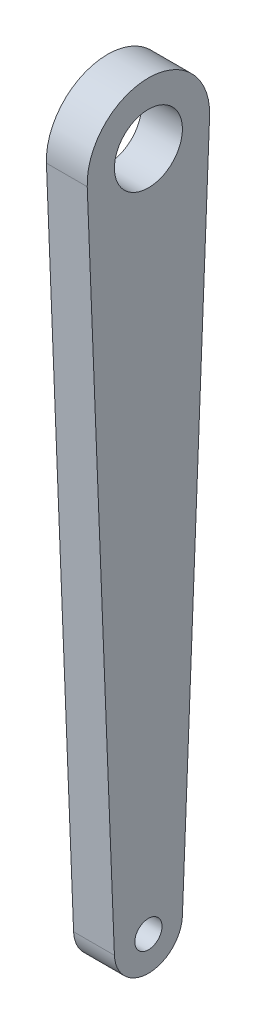
ISO-10303-21;
HEADER;
FILE_DESCRIPTION(('STEP AP214'),'2;1');
FILE_NAME('part.step','',(''),(''),'','','');
FILE_SCHEMA(('AUTOMOTIVE_DESIGN { 1 0 10303 214 1 1 1 1 }'));
ENDSEC;
DATA;
#1=APPLICATION_CONTEXT('core data for automotive mechanical design processes');
#2=APPLICATION_PROTOCOL_DEFINITION('international standard','automotive_design',2000,#1);
#3=PRODUCT_CONTEXT('',#1,'mechanical');
#4=PRODUCT('Part','Part','',(#3));
#5=PRODUCT_RELATED_PRODUCT_CATEGORY('part','',(#4));
#6=PRODUCT_DEFINITION_FORMATION('','',#4);
#7=PRODUCT_DEFINITION_CONTEXT('part definition',#1,'design');
#8=PRODUCT_DEFINITION('design','',#6,#7);
#9=PRODUCT_DEFINITION_SHAPE('','',#8);
#10=(LENGTH_UNIT() NAMED_UNIT(*) SI_UNIT(.MILLI.,.METRE.));
#11=(NAMED_UNIT(*) PLANE_ANGLE_UNIT() SI_UNIT($,.RADIAN.));
#12=(NAMED_UNIT(*) SI_UNIT($,.STERADIAN.) SOLID_ANGLE_UNIT());
#13=UNCERTAINTY_MEASURE_WITH_UNIT(LENGTH_MEASURE(1.E-05),#10,'distance_accuracy_value','');
#14=(GEOMETRIC_REPRESENTATION_CONTEXT(3) GLOBAL_UNCERTAINTY_ASSIGNED_CONTEXT((#13)) GLOBAL_UNIT_ASSIGNED_CONTEXT((#10,
#11,#12)) REPRESENTATION_CONTEXT('',''));
#15=CARTESIAN_POINT('',(0.,0.,0.));
#16=DIRECTION('',(0.,0.,1.));
#17=DIRECTION('',(1.,0.,0.));
#18=AXIS2_PLACEMENT_3D('',#15,#16,#17);
#19=CARTESIAN_POINT('',(3.,0.,0.));
#20=DIRECTION('',(1.,0.,0.));
#21=DIRECTION('',(0.,0.,-1.));
#22=AXIS2_PLACEMENT_3D('',#19,#20,#21);
#23=PLANE('',#22);
#24=CARTESIAN_POINT('',(3.,0.,0.));
#25=DIRECTION('',(1.,0.,0.));
#26=DIRECTION('',(0.,0.,-1.));
#27=AXIS2_PLACEMENT_3D('',#24,#25,#26);
#28=CIRCLE('',#27,2.5);
#29=CARTESIAN_POINT('',(3.,0.,-2.5));
#30=VERTEX_POINT('',#29);
#31=EDGE_CURVE('E112',#30,#30,#28,.T.);
#32=ORIENTED_EDGE('',*,*,#31,.F.);
#33=EDGE_LOOP('',(#32));
#34=FACE_BOUND('',#33,.T.);
#35=CARTESIAN_POINT('',(3.,0.,0.));
#36=DIRECTION('',(1.,0.,0.));
#37=DIRECTION('',(0.,0.,-1.));
#38=AXIS2_PLACEMENT_3D('',#35,#36,#37);
#39=CIRCLE('',#38,4.5);
#40=CARTESIAN_POINT('',(3.,-0.18,-4.49639855884685));
#41=VERTEX_POINT('',#40);
#42=CARTESIAN_POINT('',(3.,-0.18,4.49639855884685));
#43=VERTEX_POINT('',#42);
#44=EDGE_CURVE('E92',#41,#43,#39,.T.);
#45=ORIENTED_EDGE('',*,*,#44,.T.);
#46=DIRECTION('',(0.,-0.999199679743744,-0.0400000000000001));
#47=VECTOR('',#46,1.);
#48=CARTESIAN_POINT('',(3.,-0.18,4.49639855884685));
#49=LINE('',#48,#47);
#50=CARTESIAN_POINT('',(3.,-50.1,2.49799919935935));
#51=VERTEX_POINT('',#50);
#52=EDGE_CURVE('E87',#43,#51,#49,.T.);
#53=ORIENTED_EDGE('',*,*,#52,.T.);
#54=CARTESIAN_POINT('',(3.,-50.,0.));
#55=DIRECTION('',(1.,0.,0.));
#56=DIRECTION('',(0.,0.,-1.));
#57=AXIS2_PLACEMENT_3D('',#54,#55,#56);
#58=CIRCLE('',#57,2.49999999999999);
#59=CARTESIAN_POINT('',(3.,-50.1,-2.49799919935936));
#60=VERTEX_POINT('',#59);
#61=EDGE_CURVE('E90',#51,#60,#58,.T.);
#62=ORIENTED_EDGE('',*,*,#61,.T.);
#63=DIRECTION('',(0.,0.999199679743744,-0.0400000000000001));
#64=VECTOR('',#63,1.);
#65=CARTESIAN_POINT('',(3.,-0.18,-4.49639855884685));
#66=LINE('',#65,#64);
#67=EDGE_CURVE('E57',#60,#41,#66,.T.);
#68=ORIENTED_EDGE('',*,*,#67,.T.);
#69=EDGE_LOOP('',(#45,#53,#62,#68));
#70=FACE_BOUND('',#69,.T.);
#71=CARTESIAN_POINT('',(3.,-50.,0.));
#72=DIRECTION('',(1.,0.,0.));
#73=DIRECTION('',(0.,0.,-1.));
#74=AXIS2_PLACEMENT_3D('',#71,#72,#73);
#75=CIRCLE('',#74,1.);
#76=CARTESIAN_POINT('',(3.,-50.,-1.00000000000001));
#77=VERTEX_POINT('',#76);
#78=EDGE_CURVE('E134',#77,#77,#75,.T.);
#79=ORIENTED_EDGE('',*,*,#78,.F.);
#80=EDGE_LOOP('',(#79));
#81=FACE_BOUND('',#80,.T.);
#82=ADVANCED_FACE('F39',(#34,#70,#81),#23,.T.);
#83=CARTESIAN_POINT('',(0.,0.,0.));
#84=DIRECTION('',(1.,0.,0.));
#85=DIRECTION('',(0.,0.,-1.));
#86=AXIS2_PLACEMENT_3D('',#83,#84,#85);
#87=PLANE('',#86);
#88=CARTESIAN_POINT('',(0.,0.,0.));
#89=DIRECTION('',(1.,0.,0.));
#90=DIRECTION('',(0.,0.,-1.));
#91=AXIS2_PLACEMENT_3D('',#88,#89,#90);
#92=CIRCLE('',#91,4.5);
#93=CARTESIAN_POINT('',(0.,-0.18,-4.49639855884685));
#94=VERTEX_POINT('',#93);
#95=CARTESIAN_POINT('',(0.,-0.18,4.49639855884685));
#96=VERTEX_POINT('',#95);
#97=EDGE_CURVE('E108',#94,#96,#92,.T.);
#98=ORIENTED_EDGE('',*,*,#97,.F.);
#99=DIRECTION('',(0.,0.999199679743744,-0.0400000000000001));
#100=VECTOR('',#99,1.);
#101=CARTESIAN_POINT('',(0.,-0.18,-4.49639855884685));
#102=LINE('',#101,#100);
#103=CARTESIAN_POINT('',(0.,-50.1,-2.49799919935936));
#104=VERTEX_POINT('',#103);
#105=EDGE_CURVE('E80',#104,#94,#102,.T.);
#106=ORIENTED_EDGE('',*,*,#105,.F.);
#107=CARTESIAN_POINT('',(0.,-50.,0.));
#108=DIRECTION('',(1.,0.,0.));
#109=DIRECTION('',(0.,0.,-1.));
#110=AXIS2_PLACEMENT_3D('',#107,#108,#109);
#111=CIRCLE('',#110,2.49999999999999);
#112=CARTESIAN_POINT('',(0.,-50.1,2.49799919935935));
#113=VERTEX_POINT('',#112);
#114=EDGE_CURVE('E74',#113,#104,#111,.T.);
#115=ORIENTED_EDGE('',*,*,#114,.F.);
#116=DIRECTION('',(0.,-0.999199679743744,-0.0400000000000001));
#117=VECTOR('',#116,1.);
#118=CARTESIAN_POINT('',(0.,-0.18,4.49639855884685));
#119=LINE('',#118,#117);
#120=EDGE_CURVE('E97',#96,#113,#119,.T.);
#121=ORIENTED_EDGE('',*,*,#120,.F.);
#122=EDGE_LOOP('',(#98,#106,#115,#121));
#123=FACE_BOUND('',#122,.T.);
#124=CARTESIAN_POINT('',(0.,0.,0.));
#125=DIRECTION('',(1.,0.,0.));
#126=DIRECTION('',(0.,0.,-1.));
#127=AXIS2_PLACEMENT_3D('',#124,#125,#126);
#128=CIRCLE('',#127,2.5);
#129=CARTESIAN_POINT('',(0.,0.,-2.5));
#130=VERTEX_POINT('',#129);
#131=EDGE_CURVE('E130',#130,#130,#128,.T.);
#132=ORIENTED_EDGE('',*,*,#131,.T.);
#133=EDGE_LOOP('',(#132));
#134=FACE_BOUND('',#133,.T.);
#135=CARTESIAN_POINT('',(0.,-50.,0.));
#136=DIRECTION('',(1.,0.,0.));
#137=DIRECTION('',(0.,0.,-1.));
#138=AXIS2_PLACEMENT_3D('',#135,#136,#137);
#139=CIRCLE('',#138,1.);
#140=CARTESIAN_POINT('',(0.,-50.,-1.00000000000001));
#141=VERTEX_POINT('',#140);
#142=EDGE_CURVE('E138',#141,#141,#139,.T.);
#143=ORIENTED_EDGE('',*,*,#142,.T.);
#144=EDGE_LOOP('',(#143));
#145=FACE_BOUND('',#144,.T.);
#146=ADVANCED_FACE('F125',(#123,#134,#145),#87,.F.);
#147=CARTESIAN_POINT('',(3.,0.,0.));
#148=DIRECTION('',(-1.,0.,0.));
#149=DIRECTION('',(0.,0.,1.));
#150=AXIS2_PLACEMENT_3D('',#147,#148,#149);
#151=CYLINDRICAL_SURFACE('',#150,4.5);
#152=ORIENTED_EDGE('',*,*,#97,.T.);
#153=DIRECTION('',(-1.,0.,0.));
#154=VECTOR('',#153,1.);
#155=CARTESIAN_POINT('',(3.,-0.18,4.49639855884685));
#156=LINE('',#155,#154);
#157=EDGE_CURVE('E11',#43,#96,#156,.T.);
#158=ORIENTED_EDGE('',*,*,#157,.F.);
#159=ORIENTED_EDGE('',*,*,#44,.F.);
#160=DIRECTION('',(-1.,0.,0.));
#161=VECTOR('',#160,1.);
#162=CARTESIAN_POINT('',(3.,-0.18,-4.49639855884685));
#163=LINE('',#162,#161);
#164=EDGE_CURVE('E104',#41,#94,#163,.T.);
#165=ORIENTED_EDGE('',*,*,#164,.T.);
#166=EDGE_LOOP('',(#152,#158,#159,#165));
#167=FACE_BOUND('',#166,.T.);
#168=ADVANCED_FACE('F41',(#167),#151,.T.);
#169=CARTESIAN_POINT('',(3.,-0.18,4.49639855884685));
#170=DIRECTION('',(0.,0.0400000000000001,-0.999199679743744));
#171=DIRECTION('',(0.,0.999199679743744,0.0400000000000001));
#172=AXIS2_PLACEMENT_3D('',#169,#170,#171);
#173=PLANE('',#172);
#174=ORIENTED_EDGE('',*,*,#120,.T.);
#175=DIRECTION('',(-1.,0.,0.));
#176=VECTOR('',#175,1.);
#177=CARTESIAN_POINT('',(3.,-50.1,2.49799919935935));
#178=LINE('',#177,#176);
#179=EDGE_CURVE('E49',#51,#113,#178,.T.);
#180=ORIENTED_EDGE('',*,*,#179,.F.);
#181=ORIENTED_EDGE('',*,*,#52,.F.);
#182=ORIENTED_EDGE('',*,*,#157,.T.);
#183=EDGE_LOOP('',(#174,#180,#181,#182));
#184=FACE_BOUND('',#183,.T.);
#185=ADVANCED_FACE('F96',(#184),#173,.F.);
#186=CARTESIAN_POINT('',(3.,-50.,0.));
#187=DIRECTION('',(-1.,0.,0.));
#188=DIRECTION('',(0.,0.,1.));
#189=AXIS2_PLACEMENT_3D('',#186,#187,#188);
#190=CYLINDRICAL_SURFACE('',#189,2.49999999999999);
#191=ORIENTED_EDGE('',*,*,#114,.T.);
#192=DIRECTION('',(-1.,0.,0.));
#193=VECTOR('',#192,1.);
#194=CARTESIAN_POINT('',(3.,-50.1,-2.49799919935936));
#195=LINE('',#194,#193);
#196=EDGE_CURVE('E99',#60,#104,#195,.T.);
#197=ORIENTED_EDGE('',*,*,#196,.F.);
#198=ORIENTED_EDGE('',*,*,#61,.F.);
#199=ORIENTED_EDGE('',*,*,#179,.T.);
#200=EDGE_LOOP('',(#191,#197,#198,#199));
#201=FACE_BOUND('',#200,.T.);
#202=ADVANCED_FACE('F100',(#201),#190,.T.);
#203=CARTESIAN_POINT('',(3.,-0.18,-4.49639855884685));
#204=DIRECTION('',(0.,0.0400000000000001,0.999199679743744));
#205=DIRECTION('',(0.,-0.999199679743744,0.0400000000000001));
#206=AXIS2_PLACEMENT_3D('',#203,#204,#205);
#207=PLANE('',#206);
#208=ORIENTED_EDGE('',*,*,#105,.T.);
#209=ORIENTED_EDGE('',*,*,#164,.F.);
#210=ORIENTED_EDGE('',*,*,#67,.F.);
#211=ORIENTED_EDGE('',*,*,#196,.T.);
#212=EDGE_LOOP('',(#208,#209,#210,#211));
#213=FACE_BOUND('',#212,.T.);
#214=ADVANCED_FACE('F122',(#213),#207,.F.);
#215=CARTESIAN_POINT('',(3.,0.,0.));
#216=DIRECTION('',(-1.,0.,0.));
#217=DIRECTION('',(0.,0.,1.));
#218=AXIS2_PLACEMENT_3D('',#215,#216,#217);
#219=CYLINDRICAL_SURFACE('',#218,2.5);
#220=ORIENTED_EDGE('',*,*,#31,.T.);
#221=EDGE_LOOP('',(#220));
#222=FACE_BOUND('',#221,.T.);
#223=ORIENTED_EDGE('',*,*,#131,.F.);
#224=EDGE_LOOP('',(#223));
#225=FACE_BOUND('',#224,.T.);
#226=ADVANCED_FACE('F157',(#222,#225),#219,.F.);
#227=CARTESIAN_POINT('',(3.,-50.,0.));
#228=DIRECTION('',(-1.,0.,0.));
#229=DIRECTION('',(0.,0.,1.));
#230=AXIS2_PLACEMENT_3D('',#227,#228,#229);
#231=CYLINDRICAL_SURFACE('',#230,1.);
#232=ORIENTED_EDGE('',*,*,#78,.T.);
#233=EDGE_LOOP('',(#232));
#234=FACE_BOUND('',#233,.T.);
#235=ORIENTED_EDGE('',*,*,#142,.F.);
#236=EDGE_LOOP('',(#235));
#237=FACE_BOUND('',#236,.T.);
#238=ADVANCED_FACE('F146',(#234,#237),#231,.F.);
#239=CLOSED_SHELL('',(#82,#146,#168,#185,#202,#214,#226,#238));
#240=MANIFOLD_SOLID_BREP('B2',#239);
#241=ADVANCED_BREP_SHAPE_REPRESENTATION('',(#18,#240),#14);
#242=SHAPE_DEFINITION_REPRESENTATION(#9,#241);
ENDSEC;
END-ISO-10303-21;
